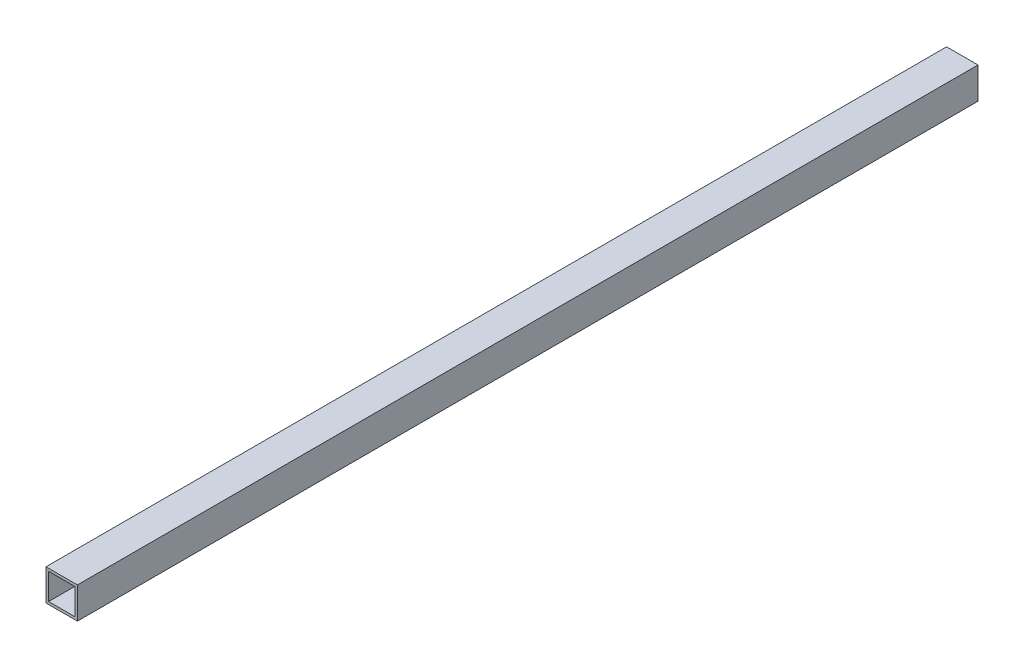
ISO-10303-21;
HEADER;
FILE_DESCRIPTION(('STEP AP214'),'2;1');
FILE_NAME('part.step','',(''),(''),'','','');
FILE_SCHEMA(('AUTOMOTIVE_DESIGN { 1 0 10303 214 1 1 1 1 }'));
ENDSEC;
DATA;
#1=APPLICATION_CONTEXT('core data for automotive mechanical design processes');
#2=APPLICATION_PROTOCOL_DEFINITION('international standard','automotive_design',2000,#1);
#3=PRODUCT_CONTEXT('',#1,'mechanical');
#4=PRODUCT('Part','Part','',(#3));
#5=PRODUCT_RELATED_PRODUCT_CATEGORY('part','',(#4));
#6=PRODUCT_DEFINITION_FORMATION('','',#4);
#7=PRODUCT_DEFINITION_CONTEXT('part definition',#1,'design');
#8=PRODUCT_DEFINITION('design','',#6,#7);
#9=PRODUCT_DEFINITION_SHAPE('','',#8);
#10=(LENGTH_UNIT() NAMED_UNIT(*) SI_UNIT(.MILLI.,.METRE.));
#11=(NAMED_UNIT(*) PLANE_ANGLE_UNIT() SI_UNIT($,.RADIAN.));
#12=(NAMED_UNIT(*) SI_UNIT($,.STERADIAN.) SOLID_ANGLE_UNIT());
#13=UNCERTAINTY_MEASURE_WITH_UNIT(LENGTH_MEASURE(1.E-05),#10,'distance_accuracy_value','');
#14=(GEOMETRIC_REPRESENTATION_CONTEXT(3) GLOBAL_UNCERTAINTY_ASSIGNED_CONTEXT((#13)) GLOBAL_UNIT_ASSIGNED_CONTEXT((#10,
#11,#12)) REPRESENTATION_CONTEXT('',''));
#15=CARTESIAN_POINT('',(0.,0.,0.));
#16=DIRECTION('',(0.,0.,1.));
#17=DIRECTION('',(1.,0.,0.));
#18=AXIS2_PLACEMENT_3D('',#15,#16,#17);
#19=CARTESIAN_POINT('',(0.,0.,273.05));
#20=DIRECTION('',(0.,0.,1.));
#21=DIRECTION('',(1.,0.,0.));
#22=AXIS2_PLACEMENT_3D('',#19,#20,#21);
#23=PLANE('',#22);
#24=DIRECTION('',(0.,-1.,0.));
#25=VECTOR('',#24,1.);
#26=CARTESIAN_POINT('',(-9.52500000000001,-9.525,273.05));
#27=LINE('',#26,#25);
#28=CARTESIAN_POINT('',(-9.52500000000001,9.525,273.05));
#29=VERTEX_POINT('',#28);
#30=CARTESIAN_POINT('',(-9.52500000000001,-9.525,273.05));
#31=VERTEX_POINT('',#30);
#32=EDGE_CURVE('E134',#29,#31,#27,.T.);
#33=ORIENTED_EDGE('',*,*,#32,.T.);
#34=DIRECTION('',(1.,0.,0.));
#35=VECTOR('',#34,1.);
#36=CARTESIAN_POINT('',(9.525,-9.525,273.05));
#37=LINE('',#36,#35);
#38=CARTESIAN_POINT('',(9.525,-9.525,273.05));
#39=VERTEX_POINT('',#38);
#40=EDGE_CURVE('E137',#31,#39,#37,.T.);
#41=ORIENTED_EDGE('',*,*,#40,.T.);
#42=DIRECTION('',(0.,1.,0.));
#43=VECTOR('',#42,1.);
#44=CARTESIAN_POINT('',(9.525,-9.525,273.05));
#45=LINE('',#44,#43);
#46=CARTESIAN_POINT('',(9.525,9.525,273.05));
#47=VERTEX_POINT('',#46);
#48=EDGE_CURVE('E140',#39,#47,#45,.T.);
#49=ORIENTED_EDGE('',*,*,#48,.T.);
#50=DIRECTION('',(-1.,0.,0.));
#51=VECTOR('',#50,1.);
#52=CARTESIAN_POINT('',(9.525,9.525,273.05));
#53=LINE('',#52,#51);
#54=EDGE_CURVE('E142',#47,#29,#53,.T.);
#55=ORIENTED_EDGE('',*,*,#54,.T.);
#56=EDGE_LOOP('',(#33,#41,#49,#55));
#57=FACE_BOUND('',#56,.T.);
#58=DIRECTION('',(1.,0.,0.));
#59=VECTOR('',#58,1.);
#60=CARTESIAN_POINT('',(7.9375,-7.93750000000001,273.05));
#61=LINE('',#60,#59);
#62=CARTESIAN_POINT('',(-7.9375,-7.93750000000001,273.05));
#63=VERTEX_POINT('',#62);
#64=CARTESIAN_POINT('',(7.9375,-7.93750000000001,273.05));
#65=VERTEX_POINT('',#64);
#66=EDGE_CURVE('E106',#63,#65,#61,.T.);
#67=ORIENTED_EDGE('',*,*,#66,.F.);
#68=DIRECTION('',(0.,-1.,0.));
#69=VECTOR('',#68,1.);
#70=CARTESIAN_POINT('',(-7.9375,-7.93750000000001,273.05));
#71=LINE('',#70,#69);
#72=CARTESIAN_POINT('',(-7.9375,7.9375,273.05));
#73=VERTEX_POINT('',#72);
#74=EDGE_CURVE('E98',#73,#63,#71,.T.);
#75=ORIENTED_EDGE('',*,*,#74,.F.);
#76=DIRECTION('',(-1.,0.,0.));
#77=VECTOR('',#76,1.);
#78=CARTESIAN_POINT('',(7.9375,7.9375,273.05));
#79=LINE('',#78,#77);
#80=CARTESIAN_POINT('',(7.9375,7.9375,273.05));
#81=VERTEX_POINT('',#80);
#82=EDGE_CURVE('E120',#81,#73,#79,.T.);
#83=ORIENTED_EDGE('',*,*,#82,.F.);
#84=DIRECTION('',(0.,1.,0.));
#85=VECTOR('',#84,1.);
#86=CARTESIAN_POINT('',(7.9375,-7.93750000000001,273.05));
#87=LINE('',#86,#85);
#88=EDGE_CURVE('E118',#65,#81,#87,.T.);
#89=ORIENTED_EDGE('',*,*,#88,.F.);
#90=EDGE_LOOP('',(#67,#75,#83,#89));
#91=FACE_BOUND('',#90,.T.);
#92=ADVANCED_FACE('F33',(#57,#91),#23,.T.);
#93=CARTESIAN_POINT('',(0.,0.,-273.05));
#94=DIRECTION('',(0.,0.,1.));
#95=DIRECTION('',(1.,0.,0.));
#96=AXIS2_PLACEMENT_3D('',#93,#94,#95);
#97=PLANE('',#96);
#98=DIRECTION('',(0.,-1.,0.));
#99=VECTOR('',#98,1.);
#100=CARTESIAN_POINT('',(-9.52500000000001,-9.525,-273.05));
#101=LINE('',#100,#99);
#102=CARTESIAN_POINT('',(-9.52500000000001,9.525,-273.05));
#103=VERTEX_POINT('',#102);
#104=CARTESIAN_POINT('',(-9.52500000000001,-9.525,-273.05));
#105=VERTEX_POINT('',#104);
#106=EDGE_CURVE('E114',#103,#105,#101,.T.);
#107=ORIENTED_EDGE('',*,*,#106,.F.);
#108=DIRECTION('',(-1.,0.,0.));
#109=VECTOR('',#108,1.);
#110=CARTESIAN_POINT('',(9.525,9.525,-273.05));
#111=LINE('',#110,#109);
#112=CARTESIAN_POINT('',(9.525,9.525,-273.05));
#113=VERTEX_POINT('',#112);
#114=EDGE_CURVE('E138',#113,#103,#111,.T.);
#115=ORIENTED_EDGE('',*,*,#114,.F.);
#116=DIRECTION('',(0.,1.,0.));
#117=VECTOR('',#116,1.);
#118=CARTESIAN_POINT('',(9.525,-9.525,-273.05));
#119=LINE('',#118,#117);
#120=CARTESIAN_POINT('',(9.525,-9.525,-273.05));
#121=VERTEX_POINT('',#120);
#122=EDGE_CURVE('E149',#121,#113,#119,.T.);
#123=ORIENTED_EDGE('',*,*,#122,.F.);
#124=DIRECTION('',(1.,0.,0.));
#125=VECTOR('',#124,1.);
#126=CARTESIAN_POINT('',(9.525,-9.525,-273.05));
#127=LINE('',#126,#125);
#128=EDGE_CURVE('E147',#105,#121,#127,.T.);
#129=ORIENTED_EDGE('',*,*,#128,.F.);
#130=EDGE_LOOP('',(#107,#115,#123,#129));
#131=FACE_BOUND('',#130,.T.);
#132=DIRECTION('',(0.,-1.,0.));
#133=VECTOR('',#132,1.);
#134=CARTESIAN_POINT('',(-7.9375,-7.93750000000001,-273.05));
#135=LINE('',#134,#133);
#136=CARTESIAN_POINT('',(-7.9375,7.9375,-273.05));
#137=VERTEX_POINT('',#136);
#138=CARTESIAN_POINT('',(-7.9375,-7.93750000000001,-273.05));
#139=VERTEX_POINT('',#138);
#140=EDGE_CURVE('E56',#137,#139,#135,.T.);
#141=ORIENTED_EDGE('',*,*,#140,.T.);
#142=DIRECTION('',(1.,0.,0.));
#143=VECTOR('',#142,1.);
#144=CARTESIAN_POINT('',(7.9375,-7.93750000000001,-273.05));
#145=LINE('',#144,#143);
#146=CARTESIAN_POINT('',(7.9375,-7.93750000000001,-273.05));
#147=VERTEX_POINT('',#146);
#148=EDGE_CURVE('E113',#139,#147,#145,.T.);
#149=ORIENTED_EDGE('',*,*,#148,.T.);
#150=DIRECTION('',(0.,1.,0.));
#151=VECTOR('',#150,1.);
#152=CARTESIAN_POINT('',(7.9375,-7.93750000000001,-273.05));
#153=LINE('',#152,#151);
#154=CARTESIAN_POINT('',(7.9375,7.9375,-273.05));
#155=VERTEX_POINT('',#154);
#156=EDGE_CURVE('E126',#147,#155,#153,.T.);
#157=ORIENTED_EDGE('',*,*,#156,.T.);
#158=DIRECTION('',(-1.,0.,0.));
#159=VECTOR('',#158,1.);
#160=CARTESIAN_POINT('',(7.9375,7.9375,-273.05));
#161=LINE('',#160,#159);
#162=EDGE_CURVE('E107',#155,#137,#161,.T.);
#163=ORIENTED_EDGE('',*,*,#162,.T.);
#164=EDGE_LOOP('',(#141,#149,#157,#163));
#165=FACE_BOUND('',#164,.T.);
#166=ADVANCED_FACE('F167',(#131,#165),#97,.F.);
#167=CARTESIAN_POINT('',(-9.52500000000001,-9.525,273.05));
#168=DIRECTION('',(1.,0.,0.));
#169=DIRECTION('',(0.,0.,-1.));
#170=AXIS2_PLACEMENT_3D('',#167,#168,#169);
#171=PLANE('',#170);
#172=ORIENTED_EDGE('',*,*,#106,.T.);
#173=DIRECTION('',(0.,0.,-1.));
#174=VECTOR('',#173,1.);
#175=CARTESIAN_POINT('',(-9.52500000000001,-9.525,273.05));
#176=LINE('',#175,#174);
#177=EDGE_CURVE('E11',#31,#105,#176,.T.);
#178=ORIENTED_EDGE('',*,*,#177,.F.);
#179=ORIENTED_EDGE('',*,*,#32,.F.);
#180=DIRECTION('',(0.,0.,-1.));
#181=VECTOR('',#180,1.);
#182=CARTESIAN_POINT('',(-9.52500000000001,9.525,273.05));
#183=LINE('',#182,#181);
#184=EDGE_CURVE('E144',#29,#103,#183,.T.);
#185=ORIENTED_EDGE('',*,*,#184,.T.);
#186=EDGE_LOOP('',(#172,#178,#179,#185));
#187=FACE_BOUND('',#186,.T.);
#188=ADVANCED_FACE('F35',(#187),#171,.F.);
#189=CARTESIAN_POINT('',(9.525,-9.525,273.05));
#190=DIRECTION('',(0.,1.,0.));
#191=DIRECTION('',(0.,0.,1.));
#192=AXIS2_PLACEMENT_3D('',#189,#190,#191);
#193=PLANE('',#192);
#194=ORIENTED_EDGE('',*,*,#128,.T.);
#195=DIRECTION('',(0.,0.,-1.));
#196=VECTOR('',#195,1.);
#197=CARTESIAN_POINT('',(9.525,-9.525,273.05));
#198=LINE('',#197,#196);
#199=EDGE_CURVE('E41',#39,#121,#198,.T.);
#200=ORIENTED_EDGE('',*,*,#199,.F.);
#201=ORIENTED_EDGE('',*,*,#40,.F.);
#202=ORIENTED_EDGE('',*,*,#177,.T.);
#203=EDGE_LOOP('',(#194,#200,#201,#202));
#204=FACE_BOUND('',#203,.T.);
#205=ADVANCED_FACE('F177',(#204),#193,.F.);
#206=CARTESIAN_POINT('',(9.525,-9.525,273.05));
#207=DIRECTION('',(-1.,0.,0.));
#208=DIRECTION('',(0.,0.,1.));
#209=AXIS2_PLACEMENT_3D('',#206,#207,#208);
#210=PLANE('',#209);
#211=ORIENTED_EDGE('',*,*,#122,.T.);
#212=DIRECTION('',(0.,0.,-1.));
#213=VECTOR('',#212,1.);
#214=CARTESIAN_POINT('',(9.525,9.525,273.05));
#215=LINE('',#214,#213);
#216=EDGE_CURVE('E154',#47,#113,#215,.T.);
#217=ORIENTED_EDGE('',*,*,#216,.F.);
#218=ORIENTED_EDGE('',*,*,#48,.F.);
#219=ORIENTED_EDGE('',*,*,#199,.T.);
#220=EDGE_LOOP('',(#211,#217,#218,#219));
#221=FACE_BOUND('',#220,.T.);
#222=ADVANCED_FACE('F161',(#221),#210,.F.);
#223=CARTESIAN_POINT('',(9.525,9.525,273.05));
#224=DIRECTION('',(0.,-1.,0.));
#225=DIRECTION('',(0.,0.,-1.));
#226=AXIS2_PLACEMENT_3D('',#223,#224,#225);
#227=PLANE('',#226);
#228=ORIENTED_EDGE('',*,*,#114,.T.);
#229=ORIENTED_EDGE('',*,*,#184,.F.);
#230=ORIENTED_EDGE('',*,*,#54,.F.);
#231=ORIENTED_EDGE('',*,*,#216,.T.);
#232=EDGE_LOOP('',(#228,#229,#230,#231));
#233=FACE_BOUND('',#232,.T.);
#234=ADVANCED_FACE('F171',(#233),#227,.F.);
#235=CARTESIAN_POINT('',(-7.9375,-7.93750000000001,273.05));
#236=DIRECTION('',(1.,0.,0.));
#237=DIRECTION('',(0.,0.,-1.));
#238=AXIS2_PLACEMENT_3D('',#235,#236,#237);
#239=PLANE('',#238);
#240=ORIENTED_EDGE('',*,*,#140,.F.);
#241=DIRECTION('',(0.,0.,-1.));
#242=VECTOR('',#241,1.);
#243=CARTESIAN_POINT('',(-7.9375,7.9375,273.05));
#244=LINE('',#243,#242);
#245=EDGE_CURVE('E102',#73,#137,#244,.T.);
#246=ORIENTED_EDGE('',*,*,#245,.F.);
#247=ORIENTED_EDGE('',*,*,#74,.T.);
#248=DIRECTION('',(0.,0.,-1.));
#249=VECTOR('',#248,1.);
#250=CARTESIAN_POINT('',(-7.9375,-7.93750000000001,273.05));
#251=LINE('',#250,#249);
#252=EDGE_CURVE('E101',#63,#139,#251,.T.);
#253=ORIENTED_EDGE('',*,*,#252,.T.);
#254=EDGE_LOOP('',(#240,#246,#247,#253));
#255=FACE_BOUND('',#254,.T.);
#256=ADVANCED_FACE('F100',(#255),#239,.T.);
#257=CARTESIAN_POINT('',(7.9375,-7.93750000000001,273.05));
#258=DIRECTION('',(0.,1.,0.));
#259=DIRECTION('',(0.,0.,1.));
#260=AXIS2_PLACEMENT_3D('',#257,#258,#259);
#261=PLANE('',#260);
#262=ORIENTED_EDGE('',*,*,#148,.F.);
#263=ORIENTED_EDGE('',*,*,#252,.F.);
#264=ORIENTED_EDGE('',*,*,#66,.T.);
#265=DIRECTION('',(0.,0.,-1.));
#266=VECTOR('',#265,1.);
#267=CARTESIAN_POINT('',(7.9375,-7.93750000000001,273.05));
#268=LINE('',#267,#266);
#269=EDGE_CURVE('E115',#65,#147,#268,.T.);
#270=ORIENTED_EDGE('',*,*,#269,.T.);
#271=EDGE_LOOP('',(#262,#263,#264,#270));
#272=FACE_BOUND('',#271,.T.);
#273=ADVANCED_FACE('F110',(#272),#261,.T.);
#274=CARTESIAN_POINT('',(7.9375,-7.93750000000001,273.05));
#275=DIRECTION('',(-1.,0.,0.));
#276=DIRECTION('',(0.,0.,1.));
#277=AXIS2_PLACEMENT_3D('',#274,#275,#276);
#278=PLANE('',#277);
#279=ORIENTED_EDGE('',*,*,#156,.F.);
#280=ORIENTED_EDGE('',*,*,#269,.F.);
#281=ORIENTED_EDGE('',*,*,#88,.T.);
#282=DIRECTION('',(0.,0.,-1.));
#283=VECTOR('',#282,1.);
#284=CARTESIAN_POINT('',(7.9375,7.9375,273.05));
#285=LINE('',#284,#283);
#286=EDGE_CURVE('E48',#81,#155,#285,.T.);
#287=ORIENTED_EDGE('',*,*,#286,.T.);
#288=EDGE_LOOP('',(#279,#280,#281,#287));
#289=FACE_BOUND('',#288,.T.);
#290=ADVANCED_FACE('F200',(#289),#278,.T.);
#291=CARTESIAN_POINT('',(7.9375,7.9375,273.05));
#292=DIRECTION('',(0.,-1.,0.));
#293=DIRECTION('',(0.,0.,-1.));
#294=AXIS2_PLACEMENT_3D('',#291,#292,#293);
#295=PLANE('',#294);
#296=ORIENTED_EDGE('',*,*,#162,.F.);
#297=ORIENTED_EDGE('',*,*,#286,.F.);
#298=ORIENTED_EDGE('',*,*,#82,.T.);
#299=ORIENTED_EDGE('',*,*,#245,.T.);
#300=EDGE_LOOP('',(#296,#297,#298,#299));
#301=FACE_BOUND('',#300,.T.);
#302=ADVANCED_FACE('F204',(#301),#295,.T.);
#303=CLOSED_SHELL('',(#92,#166,#188,#205,#222,#234,#256,#273,#290,#302));
#304=MANIFOLD_SOLID_BREP('B2',#303);
#305=ADVANCED_BREP_SHAPE_REPRESENTATION('',(#18,#304),#14);
#306=SHAPE_DEFINITION_REPRESENTATION(#9,#305);
ENDSEC;
END-ISO-10303-21;
